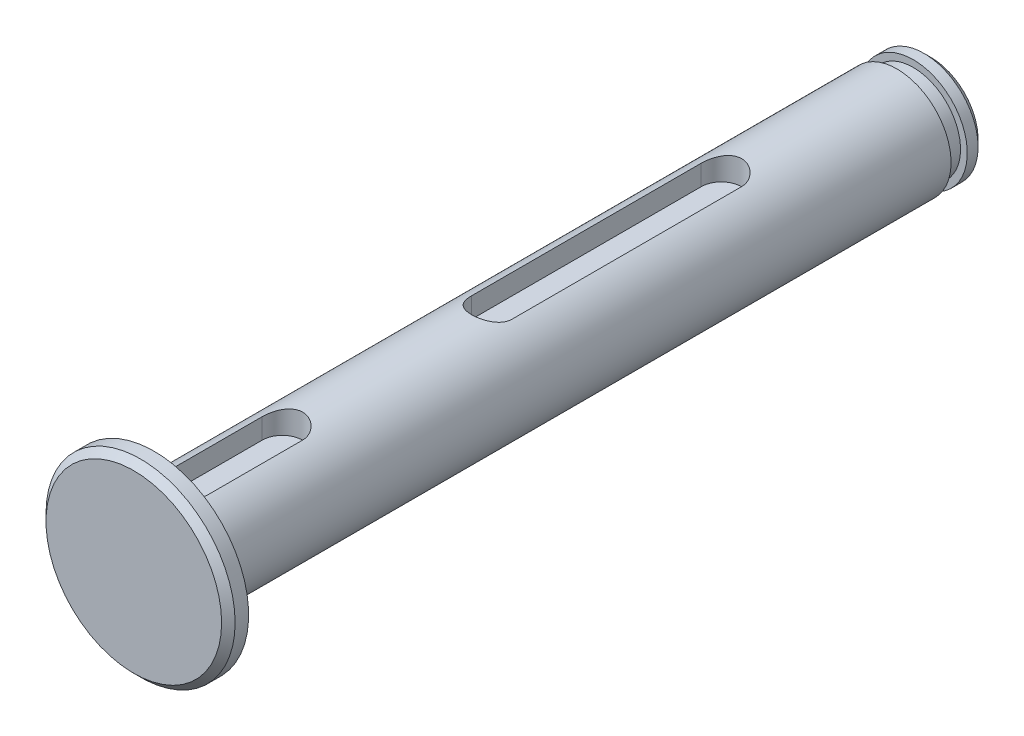
ISO-10303-21;
HEADER;
FILE_DESCRIPTION(('STEP AP214'),'2;1');
FILE_NAME('part.step','',(''),(''),'','','');
FILE_SCHEMA(('AUTOMOTIVE_DESIGN { 1 0 10303 214 1 1 1 1 }'));
ENDSEC;
DATA;
#1=APPLICATION_CONTEXT('core data for automotive mechanical design processes');
#2=APPLICATION_PROTOCOL_DEFINITION('international standard','automotive_design',2000,#1);
#3=PRODUCT_CONTEXT('',#1,'mechanical');
#4=PRODUCT('Part','Part','',(#3));
#5=PRODUCT_RELATED_PRODUCT_CATEGORY('part','',(#4));
#6=PRODUCT_DEFINITION_FORMATION('','',#4);
#7=PRODUCT_DEFINITION_CONTEXT('part definition',#1,'design');
#8=PRODUCT_DEFINITION('design','',#6,#7);
#9=PRODUCT_DEFINITION_SHAPE('','',#8);
#10=(LENGTH_UNIT() NAMED_UNIT(*) SI_UNIT(.MILLI.,.METRE.));
#11=(NAMED_UNIT(*) PLANE_ANGLE_UNIT() SI_UNIT($,.RADIAN.));
#12=(NAMED_UNIT(*) SI_UNIT($,.STERADIAN.) SOLID_ANGLE_UNIT());
#13=UNCERTAINTY_MEASURE_WITH_UNIT(LENGTH_MEASURE(1.E-05),#10,'distance_accuracy_value','');
#14=(GEOMETRIC_REPRESENTATION_CONTEXT(3) GLOBAL_UNCERTAINTY_ASSIGNED_CONTEXT((#13)) GLOBAL_UNIT_ASSIGNED_CONTEXT((#10,
#11,#12)) REPRESENTATION_CONTEXT('',''));
#15=CARTESIAN_POINT('',(0.,0.,0.));
#16=DIRECTION('',(0.,0.,1.));
#17=DIRECTION('',(1.,0.,0.));
#18=AXIS2_PLACEMENT_3D('',#15,#16,#17);
#19=CARTESIAN_POINT('',(0.,0.,-49.376724137931));
#20=DIRECTION('',(0.,0.,-1.));
#21=DIRECTION('',(-1.,0.,0.));
#22=AXIS2_PLACEMENT_3D('',#19,#20,#21);
#23=CYLINDRICAL_SURFACE('',#22,3.99999999999999);
#24=DIRECTION('',(0.,0.,-1.));
#25=VECTOR('',#24,1.);
#26=CARTESIAN_POINT('',(1.49999999999999,3.70809924354782,-49.376724137931));
#27=LINE('',#26,#25);
#28=CARTESIAN_POINT('',(1.5,3.70809924354782,14.2));
#29=VERTEX_POINT('',#28);
#30=CARTESIAN_POINT('',(1.50000000000001,3.70809924354782,31.2));
#31=VERTEX_POINT('',#30);
#32=EDGE_CURVE('E189',#29,#31,#27,.F.);
#33=ORIENTED_EDGE('',*,*,#32,.T.);
#34=CARTESIAN_POINT('',(0.,3.99999999999999,29.7));
#35=CARTESIAN_POINT('',(0.0812350589378579,4.0000021745615,29.6999970976969));
#36=CARTESIAN_POINT('',(0.162450241781797,3.99750379283183,29.7066197602484));
#37=CARTESIAN_POINT('',(0.322453452352366,3.98778696006926,29.7328281952699));
#38=CARTESIAN_POINT('',(0.401241827987621,3.98056918893992,29.7524121004706));
#39=CARTESIAN_POINT('',(0.554060784990884,3.96218832391543,29.8037530017718));
#40=CARTESIAN_POINT('',(0.628100224162283,3.95103284349438,29.8354865168218));
#41=CARTESIAN_POINT('',(0.769799310160259,3.92588767765352,29.9101064130158));
#42=CARTESIAN_POINT('',(0.837457239177885,3.91189723227546,29.9529957855442));
#43=CARTESIAN_POINT('',(0.967346417045831,3.88186246971215,30.0506125310709));
#44=CARTESIAN_POINT('',(1.0292707301512,3.86576002583564,30.1057302622594));
#45=CARTESIAN_POINT('',(1.14324421474364,3.83360220871325,30.2254104346588));
#46=CARTESIAN_POINT('',(1.19529036359203,3.81754685135031,30.2899757560879));
#47=CARTESIAN_POINT('',(1.28998202215986,3.7866247061773,30.4297174675232));
#48=CARTESIAN_POINT('',(1.3321939319576,3.77182648820817,30.5052043665458));
#49=CARTESIAN_POINT('',(1.40318646334085,3.74599860237432,30.6628483541685));
#50=CARTESIAN_POINT('',(1.4319724496124,3.73496742975879,30.7450027631551));
#51=CARTESIAN_POINT('',(1.4740843101755,3.71854412824134,30.9101167402582));
#52=CARTESIAN_POINT('',(1.48799593218558,3.71293924350836,30.9929050384354));
#53=CARTESIAN_POINT('',(1.50179556531648,3.70738061461213,31.1598161579938));
#54=CARTESIAN_POINT('',(1.50168936802631,3.70742453659303,31.2439384138745));
#55=CARTESIAN_POINT('',(1.48790429610019,3.71297511632053,31.405769525213));
#56=CARTESIAN_POINT('',(1.47503808509004,3.7181546887112,31.4835609060442));
#57=CARTESIAN_POINT('',(1.43744167868331,3.73284938059528,31.6357871504053));
#58=CARTESIAN_POINT('',(1.41270969663259,3.74236515298861,31.7102215066139));
#59=CARTESIAN_POINT('',(1.35163748571905,3.76485702190251,31.8552770677282));
#60=CARTESIAN_POINT('',(1.31508648737101,3.77789517988164,31.9257994861213));
#61=CARTESIAN_POINT('',(1.23156073762698,3.80594210139318,32.059945737591));
#62=CARTESIAN_POINT('',(1.18458238728897,3.82095154457156,32.1235671775197));
#63=CARTESIAN_POINT('',(1.07781780766549,3.85248038859111,32.2466036636509));
#64=CARTESIAN_POINT('',(1.01738298716956,3.86903347455669,32.3054486407481));
#65=CARTESIAN_POINT('',(0.887312590819027,3.90091728164084,32.4123379662058));
#66=CARTESIAN_POINT('',(0.817675603497372,3.9162478146595,32.4603806546057));
#67=CARTESIAN_POINT('',(0.669723436992429,3.94426394809078,32.5449303970625));
#68=CARTESIAN_POINT('',(0.591290713844728,3.95690498259614,32.5812475812211));
#69=CARTESIAN_POINT('',(0.428836850524591,3.97778718326961,32.63998260427));
#70=CARTESIAN_POINT('',(0.344818210845774,3.98603030341492,32.6624066165611));
#71=CARTESIAN_POINT('',(0.178375243148671,3.99684443228064,32.6916227875419));
#72=CARTESIAN_POINT('',(0.0961036195622152,3.99969369025685,32.6991826063825));
#73=CARTESIAN_POINT('',(-0.0685724752550181,4.00025893700124,32.7006910638999));
#74=CARTESIAN_POINT('',(-0.150976912983366,3.99797606386862,32.6946427203168));
#75=CARTESIAN_POINT('',(-0.310262048561852,3.98871709772642,32.6696899576913));
#76=CARTESIAN_POINT('',(-0.387233328007329,3.98192470962304,32.6512884562629));
#77=CARTESIAN_POINT('',(-0.536941754957214,3.96451477091716,32.6028139274527));
#78=CARTESIAN_POINT('',(-0.609678350347527,3.95389672282029,32.572739382052));
#79=CARTESIAN_POINT('',(-0.751247765110149,3.9294962440768,32.5008135875605));
#80=CARTESIAN_POINT('',(-0.819903083557789,3.91563000209347,32.4586422707766));
#81=CARTESIAN_POINT('',(-0.949392711726619,3.88626671564663,32.3640818968284));
#82=CARTESIAN_POINT('',(-1.01022412027044,3.87076907009515,32.3116890674548));
#83=CARTESIAN_POINT('',(-1.12603079874454,3.83873329490988,32.1945958778757));
#84=CARTESIAN_POINT('',(-1.18046154123568,3.82218696503728,32.1293578172273));
#85=CARTESIAN_POINT('',(-1.27771050031903,3.79078815746852,31.9903486152923));
#86=CARTESIAN_POINT('',(-1.32052767414518,3.77593583194398,31.9165767086115));
#87=CARTESIAN_POINT('',(-1.39337773518997,3.74966829822462,31.7619840132277));
#88=CARTESIAN_POINT('',(-1.42335685446917,3.73826760328492,31.6811352540896));
#89=CARTESIAN_POINT('',(-1.46907883466888,3.72054032891004,31.5149902363122));
#90=CARTESIAN_POINT('',(-1.48483050305534,3.71421061057489,31.4296967638019));
#91=CARTESIAN_POINT('',(-1.50086347097839,3.70775894792572,31.2629838404589));
#92=CARTESIAN_POINT('',(-1.50207331495837,3.7072644452334,31.1816673682831));
#93=CARTESIAN_POINT('',(-1.49136715641592,3.71158412745291,31.0200546837238));
#94=CARTESIAN_POINT('',(-1.47945239850123,3.71639780898898,30.9397583753284));
#95=CARTESIAN_POINT('',(-1.44355815630241,3.73048141585431,30.7849527732835));
#96=CARTESIAN_POINT('',(-1.41995798316524,3.73961085376662,30.7103416537547));
#97=CARTESIAN_POINT('',(-1.36169696779919,3.76121548297843,30.5660944915056));
#98=CARTESIAN_POINT('',(-1.32703332944944,3.77369151995213,30.4964597119299));
#99=CARTESIAN_POINT('',(-1.24552075938153,3.80139723903963,30.3601732103024));
#100=CARTESIAN_POINT('',(-1.1981283280301,3.81673698440963,30.2938692032001));
#101=CARTESIAN_POINT('',(-1.09334485729906,3.84806246757176,30.1698584390288));
#102=CARTESIAN_POINT('',(-1.03595064012808,3.86404840943144,30.1121544252132));
#103=CARTESIAN_POINT('',(-0.909080396784617,3.8959042460988,30.0037980441782));
#104=CARTESIAN_POINT('',(-0.839118644212986,3.91172104900643,29.9536962465653));
#105=CARTESIAN_POINT('',(-0.691213223200815,3.94054514457029,29.8659773447234));
#106=CARTESIAN_POINT('',(-0.613268934090616,3.95355221851558,29.8283612122636));
#107=CARTESIAN_POINT('',(-0.447999082002307,3.97574292606679,29.7656231709517));
#108=CARTESIAN_POINT('',(-0.360413422234203,3.98473657158355,29.7411129353981));
#109=CARTESIAN_POINT('',(-0.181875733606377,3.99686242179585,29.7083070400793));
#110=CARTESIAN_POINT('',(-0.0909254163648536,3.99999756603966,29.7000032485127));
#111=CARTESIAN_POINT('',(0.,3.99999999999999,29.7));
#112=B_SPLINE_CURVE_WITH_KNOTS('',3,(#34,#35,#36,#37,#38,#39,#40,#41,#42,#43,#44,#45,#46,#47,
#48,#49,#50,#51,#52,#53,#54,#55,#56,#57,#58,#59,#60,#61,#62,#63,#64,#65,#66,#67,#68,#69,#70,#71,
#72,#73,#74,#75,#76,#77,#78,#79,#80,#81,#82,#83,#84,#85,#86,#87,#88,#89,#90,#91,#92,#93,#94,#95,
#96,#97,#98,#99,#100,#101,#102,#103,#104,#105,#106,#107,#108,#109,#110,#111),.UNSPECIFIED.,.T.,
.F.,(4,2,2,2,2,2,2,2,2,2,2,2,2,2,2,2,2,2,2,2,2,2,2,2,2,2,2,2,2,2,2,2,2,2,2,2,2,2,4),(0.,
0.24336980156056,0.48670454953046,0.729571369213574,0.972503379609491,1.22473618582716,
1.47704604925622,1.73896674501659,2.00078269352134,2.25185874416902,2.50283106079708,
2.73878345119971,2.97477138060588,3.21522408387018,3.45575990744258,3.71246153335813,
3.96920257905065,4.22991375286075,4.49050899698846,4.73725019635925,4.9839366839052,
5.2211443792384,5.45838293254453,5.70259221859599,5.94689180019867,6.20536519455657,
6.46386178920141,6.72343066727203,6.98283874956506,7.22558763480252,7.46831350211259,
7.70363142426533,7.93900886656506,8.18672471884271,8.43451941997062,8.69572329654039,
8.95694749805102,9.22948515032042,9.50188601796127),.UNSPECIFIED.);
#113=CARTESIAN_POINT('',(-1.5,3.70809924354782,31.2));
#114=VERTEX_POINT('',#113);
#115=EDGE_CURVE('E212',#31,#114,#112,.T.);
#116=ORIENTED_EDGE('',*,*,#115,.T.);
#117=DIRECTION('',(0.,0.,-1.));
#118=VECTOR('',#117,1.);
#119=CARTESIAN_POINT('',(-1.50000000000001,3.70809924354781,-49.376724137931));
#120=LINE('',#119,#118);
#121=CARTESIAN_POINT('',(-1.50000000000001,3.70809924354781,14.2));
#122=VERTEX_POINT('',#121);
#123=EDGE_CURVE('E180',#114,#122,#120,.T.);
#124=ORIENTED_EDGE('',*,*,#123,.T.);
#125=CARTESIAN_POINT('',(0.,3.99999999999999,12.7));
#126=CARTESIAN_POINT('',(0.0812350589378556,4.0000021745615,12.6999970976969));
#127=CARTESIAN_POINT('',(0.162450241781795,3.99750379283183,12.7066197602484));
#128=CARTESIAN_POINT('',(0.322453452352363,3.98778696006926,12.7328281952699));
#129=CARTESIAN_POINT('',(0.401241827987618,3.98056918893992,12.7524121004706));
#130=CARTESIAN_POINT('',(0.554060784990881,3.96218832391543,12.8037530017718));
#131=CARTESIAN_POINT('',(0.628100224162279,3.95103284349439,12.8354865168218));
#132=CARTESIAN_POINT('',(0.769799310160255,3.92588767765352,12.9101064130158));
#133=CARTESIAN_POINT('',(0.837457239177881,3.91189723227546,12.9529957855442));
#134=CARTESIAN_POINT('',(0.967346417045827,3.88186246971215,13.0506125310709));
#135=CARTESIAN_POINT('',(1.02927073015119,3.86576002583564,13.1057302622594));
#136=CARTESIAN_POINT('',(1.14324421474363,3.83360220871325,13.2254104346588));
#137=CARTESIAN_POINT('',(1.19529036359203,3.81754685135031,13.2899757560879));
#138=CARTESIAN_POINT('',(1.28998202215985,3.7866247061773,13.4297174675232));
#139=CARTESIAN_POINT('',(1.3321939319576,3.77182648820817,13.5052043665458));
#140=CARTESIAN_POINT('',(1.40318646334085,3.74599860237432,13.6628483541685));
#141=CARTESIAN_POINT('',(1.43197244961239,3.73496742975879,13.7450027631551));
#142=CARTESIAN_POINT('',(1.47408431017549,3.71854412824134,13.9101167402582));
#143=CARTESIAN_POINT('',(1.48799593218558,3.71293924350836,13.9929050384354));
#144=CARTESIAN_POINT('',(1.50179556531648,3.70738061461213,14.1598161579938));
#145=CARTESIAN_POINT('',(1.50168936802631,3.70742453659303,14.2439384138745));
#146=CARTESIAN_POINT('',(1.48790429610018,3.71297511632053,14.405769525213));
#147=CARTESIAN_POINT('',(1.47503808509004,3.7181546887112,14.4835609060442));
#148=CARTESIAN_POINT('',(1.4374416786833,3.73284938059528,14.6357871504053));
#149=CARTESIAN_POINT('',(1.41270969663259,3.74236515298861,14.7102215066139));
#150=CARTESIAN_POINT('',(1.35163748571904,3.76485702190251,14.8552770677282));
#151=CARTESIAN_POINT('',(1.31508648737101,3.77789517988164,14.9257994861213));
#152=CARTESIAN_POINT('',(1.23156073762698,3.80594210139318,15.059945737591));
#153=CARTESIAN_POINT('',(1.18458238728897,3.82095154457156,15.1235671775197));
#154=CARTESIAN_POINT('',(1.07781780766549,3.85248038859111,15.2466036636509));
#155=CARTESIAN_POINT('',(1.01738298716956,3.86903347455669,15.3054486407481));
#156=CARTESIAN_POINT('',(0.887312590819025,3.90091728164084,15.4123379662058));
#157=CARTESIAN_POINT('',(0.817675603497368,3.9162478146595,15.4603806546057));
#158=CARTESIAN_POINT('',(0.669723436992423,3.94426394809078,15.5449303970625));
#159=CARTESIAN_POINT('',(0.591290713844723,3.95690498259615,15.5812475812211));
#160=CARTESIAN_POINT('',(0.428836850524587,3.97778718326961,15.63998260427));
#161=CARTESIAN_POINT('',(0.344818210845772,3.98603030341492,15.6624066165611));
#162=CARTESIAN_POINT('',(0.17837524314867,3.99684443228064,15.6916227875419));
#163=CARTESIAN_POINT('',(0.0961036195622138,3.99969369025685,15.6991826063825));
#164=CARTESIAN_POINT('',(-0.0685724752550199,4.00025893700124,15.7006910638999));
#165=CARTESIAN_POINT('',(-0.150976912983369,3.99797606386862,15.6946427203168));
#166=CARTESIAN_POINT('',(-0.310262048561855,3.98871709772642,15.6696899576913));
#167=CARTESIAN_POINT('',(-0.387233328007333,3.98192470962303,15.6512884562629));
#168=CARTESIAN_POINT('',(-0.536941754957218,3.96451477091716,15.6028139274527));
#169=CARTESIAN_POINT('',(-0.609678350347531,3.95389672282029,15.572739382052));
#170=CARTESIAN_POINT('',(-0.751247765110151,3.9294962440768,15.5008135875605));
#171=CARTESIAN_POINT('',(-0.819903083557791,3.91563000209347,15.4586422707766));
#172=CARTESIAN_POINT('',(-0.949392711726621,3.88626671564663,15.3640818968284));
#173=CARTESIAN_POINT('',(-1.01022412027045,3.87076907009515,15.3116890674548));
#174=CARTESIAN_POINT('',(-1.12603079874454,3.83873329490988,15.1945958778757));
#175=CARTESIAN_POINT('',(-1.18046154123568,3.82218696503728,15.1293578172273));
#176=CARTESIAN_POINT('',(-1.27771050031903,3.79078815746852,14.9903486152923));
#177=CARTESIAN_POINT('',(-1.32052767414518,3.77593583194398,14.9165767086115));
#178=CARTESIAN_POINT('',(-1.39337773518997,3.74966829822462,14.7619840132277));
#179=CARTESIAN_POINT('',(-1.42335685446918,3.73826760328492,14.6811352540896));
#180=CARTESIAN_POINT('',(-1.46907883466889,3.72054032891004,14.5149902363122));
#181=CARTESIAN_POINT('',(-1.48483050305535,3.71421061057489,14.4296967638019));
#182=CARTESIAN_POINT('',(-1.50086347097839,3.70775894792572,14.2629838404589));
#183=CARTESIAN_POINT('',(-1.50207331495837,3.7072644452334,14.1816673682831));
#184=CARTESIAN_POINT('',(-1.49136715641592,3.71158412745291,14.0200546837238));
#185=CARTESIAN_POINT('',(-1.47945239850123,3.71639780898897,13.9397583753284));
#186=CARTESIAN_POINT('',(-1.44355815630241,3.73048141585431,13.7849527732834));
#187=CARTESIAN_POINT('',(-1.41995798316524,3.73961085376661,13.7103416537547));
#188=CARTESIAN_POINT('',(-1.36169696779919,3.76121548297843,13.5660944915056));
#189=CARTESIAN_POINT('',(-1.32703332944944,3.77369151995213,13.4964597119299));
#190=CARTESIAN_POINT('',(-1.24552075938154,3.80139723903963,13.3601732103024));
#191=CARTESIAN_POINT('',(-1.1981283280301,3.81673698440963,13.2938692032001));
#192=CARTESIAN_POINT('',(-1.09334485729906,3.84806246757176,13.1698584390288));
#193=CARTESIAN_POINT('',(-1.03595064012808,3.86404840943144,13.1121544252132));
#194=CARTESIAN_POINT('',(-0.909080396784622,3.8959042460988,13.0037980441782));
#195=CARTESIAN_POINT('',(-0.839118644212992,3.91172104900643,12.9536962465653));
#196=CARTESIAN_POINT('',(-0.691213223200821,3.94054514457029,12.8659773447234));
#197=CARTESIAN_POINT('',(-0.613268934090621,3.95355221851558,12.8283612122636));
#198=CARTESIAN_POINT('',(-0.447999082002311,3.97574292606679,12.7656231709517));
#199=CARTESIAN_POINT('',(-0.360413422234206,3.98473657158355,12.7411129353981));
#200=CARTESIAN_POINT('',(-0.181875733606379,3.99686242179585,12.7083070400793));
#201=CARTESIAN_POINT('',(-0.0909254163648563,3.99999756603966,12.7000032485127));
#202=CARTESIAN_POINT('',(0.,3.99999999999999,12.7));
#203=B_SPLINE_CURVE_WITH_KNOTS('',3,(#125,#126,#127,#128,#129,#130,#131,#132,#133,#134,#135,
#136,#137,#138,#139,#140,#141,#142,#143,#144,#145,#146,#147,#148,#149,#150,#151,#152,#153,#154,
#155,#156,#157,#158,#159,#160,#161,#162,#163,#164,#165,#166,#167,#168,#169,#170,#171,#172,#173,
#174,#175,#176,#177,#178,#179,#180,#181,#182,#183,#184,#185,#186,#187,#188,#189,#190,#191,#192,
#193,#194,#195,#196,#197,#198,#199,#200,#201,#202),.UNSPECIFIED.,.T.,.F.,(4,2,2,2,2,2,2,2,2,2,2,
2,2,2,2,2,2,2,2,2,2,2,2,2,2,2,2,2,2,2,2,2,2,2,2,2,2,2,4),(0.,0.243369801560559,0.48670454953046,
0.729571369213572,0.972503379609489,1.22473618582715,1.47704604925622,1.73896674501659,
2.00078269352134,2.25185874416901,2.50283106079707,2.73878345119971,2.97477138060589,
3.21522408387018,3.45575990744258,3.71246153335813,3.96920257905066,4.22991375286075,
4.49050899698845,4.73725019635925,4.9839366839052,5.2211443792384,5.45838293254453,
5.70259221859599,5.94689180019867,6.20536519455657,6.4638617892014,6.72343066727203,
6.98283874956506,7.22558763480252,7.46831350211258,7.70363142426533,7.93900886656506,
8.1867247188427,8.43451941997061,8.69572329654039,8.95694749805102,9.22948515032042,
9.50188601796127),.UNSPECIFIED.);
#204=EDGE_CURVE('E183',#122,#29,#203,.T.);
#205=ORIENTED_EDGE('',*,*,#204,.T.);
#206=EDGE_LOOP('',(#33,#116,#124,#205));
#207=FACE_BOUND('',#206,.T.);
#208=CARTESIAN_POINT('',(0.,0.,56.2));
#209=DIRECTION('',(0.,0.,-1.));
#210=DIRECTION('',(-1.,0.,0.));
#211=AXIS2_PLACEMENT_3D('',#208,#209,#210);
#212=CIRCLE('',#211,3.99999999999999);
#213=CARTESIAN_POINT('',(-3.99999999999999,0.,56.2));
#214=VERTEX_POINT('',#213);
#215=EDGE_CURVE('E153',#214,#214,#212,.T.);
#216=ORIENTED_EDGE('',*,*,#215,.T.);
#217=EDGE_LOOP('',(#216));
#218=FACE_BOUND('',#217,.T.);
#219=CARTESIAN_POINT('',(0.,0.,1.2));
#220=DIRECTION('',(0.,0.,-1.));
#221=DIRECTION('',(-1.,0.,0.));
#222=AXIS2_PLACEMENT_3D('',#219,#220,#221);
#223=CIRCLE('',#222,3.99999999999999);
#224=CARTESIAN_POINT('',(-3.99999999999999,0.,1.2));
#225=VERTEX_POINT('',#224);
#226=EDGE_CURVE('E156',#225,#225,#223,.T.);
#227=ORIENTED_EDGE('',*,*,#226,.F.);
#228=EDGE_LOOP('',(#227));
#229=FACE_BOUND('',#228,.T.);
#230=DIRECTION('',(0.,0.,-1.));
#231=VECTOR('',#230,1.);
#232=CARTESIAN_POINT('',(-1.50000000000001,3.70809924354781,-49.376724137931));
#233=LINE('',#232,#231);
#234=CARTESIAN_POINT('',(-1.49999999999999,3.70809924354782,53.7));
#235=VERTEX_POINT('',#234);
#236=CARTESIAN_POINT('',(-1.49999999999999,3.70809924354782,46.7));
#237=VERTEX_POINT('',#236);
#238=EDGE_CURVE('E43',#235,#237,#233,.T.);
#239=ORIENTED_EDGE('',*,*,#238,.T.);
#240=CARTESIAN_POINT('',(0.,3.99999999999999,45.2));
#241=CARTESIAN_POINT('',(0.0812350589378599,4.0000021745615,45.1999970976969));
#242=CARTESIAN_POINT('',(0.162450241781799,3.99750379283183,45.2066197602484));
#243=CARTESIAN_POINT('',(0.322453452352368,3.98778696006926,45.2328281952699));
#244=CARTESIAN_POINT('',(0.401241827987623,3.98056918893992,45.2524121004706));
#245=CARTESIAN_POINT('',(0.554060784990886,3.96218832391543,45.3037530017718));
#246=CARTESIAN_POINT('',(0.628100224162285,3.95103284349438,45.3354865168218));
#247=CARTESIAN_POINT('',(0.769799310160262,3.92588767765351,45.4101064130158));
#248=CARTESIAN_POINT('',(0.837457239177888,3.91189723227546,45.4529957855442));
#249=CARTESIAN_POINT('',(0.967346417045836,3.88186246971215,45.5506125310709));
#250=CARTESIAN_POINT('',(1.0292707301512,3.86576002583564,45.6057302622594));
#251=CARTESIAN_POINT('',(1.14324421474364,3.83360220871325,45.7254104346589));
#252=CARTESIAN_POINT('',(1.19529036359204,3.81754685135031,45.7899757560879));
#253=CARTESIAN_POINT('',(1.28998202215986,3.7866247061773,45.9297174675232));
#254=CARTESIAN_POINT('',(1.3321939319576,3.77182648820817,46.0052043665458));
#255=CARTESIAN_POINT('',(1.40318646334085,3.74599860237432,46.1628483541685));
#256=CARTESIAN_POINT('',(1.4319724496124,3.73496742975879,46.2450027631551));
#257=CARTESIAN_POINT('',(1.4740843101755,3.71854412824134,46.4101167402582));
#258=CARTESIAN_POINT('',(1.48799593218558,3.71293924350836,46.4929050384354));
#259=CARTESIAN_POINT('',(1.50179556531649,3.70738061461213,46.6598161579938));
#260=CARTESIAN_POINT('',(1.50168936802631,3.70742453659303,46.7439384138745));
#261=CARTESIAN_POINT('',(1.48790429610019,3.71297511632053,46.905769525213));
#262=CARTESIAN_POINT('',(1.47503808509004,3.7181546887112,46.9835609060442));
#263=CARTESIAN_POINT('',(1.43744167868331,3.73284938059528,47.1357871504053));
#264=CARTESIAN_POINT('',(1.41270969663259,3.74236515298861,47.2102215066139));
#265=CARTESIAN_POINT('',(1.35163748571905,3.76485702190251,47.3552770677282));
#266=CARTESIAN_POINT('',(1.31508648737101,3.77789517988164,47.4257994861213));
#267=CARTESIAN_POINT('',(1.23156073762699,3.80594210139318,47.559945737591));
#268=CARTESIAN_POINT('',(1.18458238728897,3.82095154457156,47.6235671775197));
#269=CARTESIAN_POINT('',(1.07781780766549,3.85248038859111,47.7466036636509));
#270=CARTESIAN_POINT('',(1.01738298716956,3.86903347455669,47.8054486407481));
#271=CARTESIAN_POINT('',(0.887312590819023,3.90091728164084,47.9123379662058));
#272=CARTESIAN_POINT('',(0.817675603497366,3.9162478146595,47.9603806546057));
#273=CARTESIAN_POINT('',(0.669723436992421,3.94426394809078,48.0449303970625));
#274=CARTESIAN_POINT('',(0.59129071384472,3.95690498259615,48.0812475812211));
#275=CARTESIAN_POINT('',(0.428836850524585,3.97778718326961,48.13998260427));
#276=CARTESIAN_POINT('',(0.344818210845771,3.98603030341492,48.1624066165611));
#277=CARTESIAN_POINT('',(0.17837524314867,3.99684443228064,48.1916227875419));
#278=CARTESIAN_POINT('',(0.0961036195622148,3.99969369025685,48.1991826063825));
#279=CARTESIAN_POINT('',(-0.0685724752550182,4.00025893700124,48.2006910638999));
#280=CARTESIAN_POINT('',(-0.150976912983367,3.99797606386862,48.1946427203168));
#281=CARTESIAN_POINT('',(-0.310262048561852,3.98871709772642,48.1696899576913));
#282=CARTESIAN_POINT('',(-0.387233328007329,3.98192470962304,48.1512884562629));
#283=CARTESIAN_POINT('',(-0.536941754957214,3.96451477091716,48.1028139274527));
#284=CARTESIAN_POINT('',(-0.609678350347527,3.95389672282029,48.072739382052));
#285=CARTESIAN_POINT('',(-0.751247765110148,3.9294962440768,48.0008135875605));
#286=CARTESIAN_POINT('',(-0.819903083557788,3.91563000209347,47.9586422707766));
#287=CARTESIAN_POINT('',(-0.949392711726618,3.88626671564663,47.8640818968284));
#288=CARTESIAN_POINT('',(-1.01022412027044,3.87076907009515,47.8116890674548));
#289=CARTESIAN_POINT('',(-1.12603079874453,3.83873329490988,47.6945958778757));
#290=CARTESIAN_POINT('',(-1.18046154123568,3.82218696503728,47.6293578172273));
#291=CARTESIAN_POINT('',(-1.27771050031902,3.79078815746852,47.4903486152923));
#292=CARTESIAN_POINT('',(-1.32052767414518,3.77593583194398,47.4165767086115));
#293=CARTESIAN_POINT('',(-1.39337773518997,3.74966829822462,47.2619840132277));
#294=CARTESIAN_POINT('',(-1.42335685446917,3.73826760328492,47.1811352540896));
#295=CARTESIAN_POINT('',(-1.46907883466888,3.72054032891004,47.0149902363122));
#296=CARTESIAN_POINT('',(-1.48483050305534,3.71421061057489,46.9296967638019));
#297=CARTESIAN_POINT('',(-1.50086347097838,3.70775894792572,46.7629838404589));
#298=CARTESIAN_POINT('',(-1.50207331495837,3.7072644452334,46.6816673682831));
#299=CARTESIAN_POINT('',(-1.49136715641592,3.71158412745291,46.5200546837238));
#300=CARTESIAN_POINT('',(-1.47945239850123,3.71639780898898,46.4397583753284));
#301=CARTESIAN_POINT('',(-1.44355815630241,3.73048141585431,46.2849527732835));
#302=CARTESIAN_POINT('',(-1.41995798316523,3.73961085376662,46.2103416537547));
#303=CARTESIAN_POINT('',(-1.36169696779919,3.76121548297844,46.0660944915056));
#304=CARTESIAN_POINT('',(-1.32703332944944,3.77369151995213,45.9964597119299));
#305=CARTESIAN_POINT('',(-1.24552075938153,3.80139723903963,45.8601732103024));
#306=CARTESIAN_POINT('',(-1.19812832803009,3.81673698440963,45.7938692032001));
#307=CARTESIAN_POINT('',(-1.09334485729905,3.84806246757176,45.6698584390288));
#308=CARTESIAN_POINT('',(-1.03595064012807,3.86404840943144,45.6121544252132));
#309=CARTESIAN_POINT('',(-0.909080396784611,3.8959042460988,45.5037980441782));
#310=CARTESIAN_POINT('',(-0.839118644212981,3.91172104900643,45.4536962465653));
#311=CARTESIAN_POINT('',(-0.69121322320081,3.94054514457029,45.3659773447234));
#312=CARTESIAN_POINT('',(-0.613268934090611,3.95355221851558,45.3283612122636));
#313=CARTESIAN_POINT('',(-0.447999082002302,3.97574292606679,45.2656231709517));
#314=CARTESIAN_POINT('',(-0.360413422234199,3.98473657158355,45.2411129353981));
#315=CARTESIAN_POINT('',(-0.181875733606374,3.99686242179585,45.2083070400793));
#316=CARTESIAN_POINT('',(-0.0909254163648513,3.99999756603966,45.2000032485127));
#317=CARTESIAN_POINT('',(0.,3.99999999999999,45.2));
#318=B_SPLINE_CURVE_WITH_KNOTS('',3,(#240,#241,#242,#243,#244,#245,#246,#247,#248,#249,#250,
#251,#252,#253,#254,#255,#256,#257,#258,#259,#260,#261,#262,#263,#264,#265,#266,#267,#268,#269,
#270,#271,#272,#273,#274,#275,#276,#277,#278,#279,#280,#281,#282,#283,#284,#285,#286,#287,#288,
#289,#290,#291,#292,#293,#294,#295,#296,#297,#298,#299,#300,#301,#302,#303,#304,#305,#306,#307,
#308,#309,#310,#311,#312,#313,#314,#315,#316,#317),.UNSPECIFIED.,.T.,.F.,(4,2,2,2,2,2,2,2,2,2,2,
2,2,2,2,2,2,2,2,2,2,2,2,2,2,2,2,2,2,2,2,2,2,2,2,2,2,2,4),(0.,0.243369801560561,
0.486704549530461,0.729571369213574,0.972503379609492,1.22473618582716,1.47704604925622,
1.73896674501658,2.00078269352134,2.25185874416901,2.50283106079707,2.73878345119971,
2.97477138060589,3.21522408387018,3.45575990744258,3.71246153335813,3.96920257905066,
4.22991375286076,4.49050899698846,4.73725019635925,4.98393668390521,5.2211443792384,
5.45838293254453,5.70259221859599,5.94689180019867,6.20536519455657,6.46386178920141,
6.72343066727202,6.98283874956507,7.22558763480252,7.46831350211258,7.70363142426534,
7.93900886656507,8.18672471884272,8.43451941997062,8.69572329654039,8.95694749805102,
9.22948515032042,9.50188601796127),.UNSPECIFIED.);
#319=CARTESIAN_POINT('',(1.50000000000001,3.70809924354782,46.7));
#320=VERTEX_POINT('',#319);
#321=EDGE_CURVE('E11',#237,#320,#318,.T.);
#322=ORIENTED_EDGE('',*,*,#321,.T.);
#323=DIRECTION('',(0.,0.,-1.));
#324=VECTOR('',#323,1.);
#325=CARTESIAN_POINT('',(1.49999999999999,3.70809924354782,-49.376724137931));
#326=LINE('',#325,#324);
#327=CARTESIAN_POINT('',(1.49999999999999,3.70809924354782,53.7));
#328=VERTEX_POINT('',#327);
#329=EDGE_CURVE('E108',#320,#328,#326,.F.);
#330=ORIENTED_EDGE('',*,*,#329,.T.);
#331=CARTESIAN_POINT('',(0.,3.99999999999999,52.2));
#332=CARTESIAN_POINT('',(0.0812350589378609,4.0000021745615,52.1999970976969));
#333=CARTESIAN_POINT('',(0.1624502417818,3.99750379283183,52.2066197602484));
#334=CARTESIAN_POINT('',(0.322453452352369,3.98778696006926,52.2328281952699));
#335=CARTESIAN_POINT('',(0.401241827987624,3.98056918893992,52.2524121004706));
#336=CARTESIAN_POINT('',(0.554060784990888,3.96218832391543,52.3037530017718));
#337=CARTESIAN_POINT('',(0.628100224162286,3.95103284349438,52.3354865168218));
#338=CARTESIAN_POINT('',(0.769799310160263,3.92588767765351,52.4101064130158));
#339=CARTESIAN_POINT('',(0.837457239177889,3.91189723227546,52.4529957855442));
#340=CARTESIAN_POINT('',(0.967346417045835,3.88186246971215,52.5506125310709));
#341=CARTESIAN_POINT('',(1.0292707301512,3.86576002583564,52.6057302622594));
#342=CARTESIAN_POINT('',(1.14324421474364,3.83360220871325,52.7254104346588));
#343=CARTESIAN_POINT('',(1.19529036359203,3.81754685135031,52.7899757560879));
#344=CARTESIAN_POINT('',(1.28998202215986,3.7866247061773,52.9297174675232));
#345=CARTESIAN_POINT('',(1.33219393195761,3.77182648820817,53.0052043665458));
#346=CARTESIAN_POINT('',(1.40318646334085,3.74599860237431,53.1628483541685));
#347=CARTESIAN_POINT('',(1.4319724496124,3.73496742975879,53.2450027631551));
#348=CARTESIAN_POINT('',(1.4740843101755,3.71854412824134,53.4101167402582));
#349=CARTESIAN_POINT('',(1.48799593218559,3.71293924350836,53.4929050384354));
#350=CARTESIAN_POINT('',(1.50179556531649,3.70738061461213,53.6598161579938));
#351=CARTESIAN_POINT('',(1.50168936802631,3.70742453659303,53.7439384138745));
#352=CARTESIAN_POINT('',(1.48790429610019,3.71297511632053,53.905769525213));
#353=CARTESIAN_POINT('',(1.47503808509004,3.7181546887112,53.9835609060442));
#354=CARTESIAN_POINT('',(1.43744167868331,3.73284938059528,54.1357871504053));
#355=CARTESIAN_POINT('',(1.41270969663259,3.74236515298861,54.2102215066139));
#356=CARTESIAN_POINT('',(1.35163748571905,3.76485702190251,54.3552770677282));
#357=CARTESIAN_POINT('',(1.31508648737102,3.77789517988164,54.4257994861213));
#358=CARTESIAN_POINT('',(1.23156073762699,3.80594210139317,54.559945737591));
#359=CARTESIAN_POINT('',(1.18458238728898,3.82095154457156,54.6235671775197));
#360=CARTESIAN_POINT('',(1.07781780766549,3.85248038859111,54.7466036636509));
#361=CARTESIAN_POINT('',(1.01738298716956,3.86903347455669,54.8054486407481));
#362=CARTESIAN_POINT('',(0.887312590819025,3.90091728164084,54.9123379662058));
#363=CARTESIAN_POINT('',(0.817675603497367,3.9162478146595,54.9603806546057));
#364=CARTESIAN_POINT('',(0.669723436992422,3.94426394809078,55.0449303970625));
#365=CARTESIAN_POINT('',(0.591290713844722,3.95690498259615,55.0812475812211));
#366=CARTESIAN_POINT('',(0.428836850524588,3.97778718326961,55.13998260427));
#367=CARTESIAN_POINT('',(0.344818210845772,3.98603030341492,55.1624066165611));
#368=CARTESIAN_POINT('',(0.178375243148671,3.99684443228064,55.1916227875419));
#369=CARTESIAN_POINT('',(0.096103619562216,3.99969369025685,55.1991826063825));
#370=CARTESIAN_POINT('',(-0.0685724752550171,4.00025893700124,55.2006910638999));
#371=CARTESIAN_POINT('',(-0.150976912983366,3.99797606386862,55.1946427203168));
#372=CARTESIAN_POINT('',(-0.310262048561852,3.98871709772642,55.1696899576913));
#373=CARTESIAN_POINT('',(-0.38723332800733,3.98192470962304,55.1512884562629));
#374=CARTESIAN_POINT('',(-0.536941754957214,3.96451477091716,55.1028139274527));
#375=CARTESIAN_POINT('',(-0.609678350347527,3.95389672282029,55.072739382052));
#376=CARTESIAN_POINT('',(-0.751247765110147,3.9294962440768,55.0008135875605));
#377=CARTESIAN_POINT('',(-0.819903083557787,3.91563000209347,54.9586422707766));
#378=CARTESIAN_POINT('',(-0.949392711726617,3.88626671564663,54.8640818968284));
#379=CARTESIAN_POINT('',(-1.01022412027044,3.87076907009515,54.8116890674548));
#380=CARTESIAN_POINT('',(-1.12603079874453,3.83873329490988,54.6945958778757));
#381=CARTESIAN_POINT('',(-1.18046154123568,3.82218696503728,54.6293578172273));
#382=CARTESIAN_POINT('',(-1.27771050031902,3.79078815746852,54.4903486152923));
#383=CARTESIAN_POINT('',(-1.32052767414518,3.77593583194398,54.4165767086115));
#384=CARTESIAN_POINT('',(-1.39337773518997,3.74966829822462,54.2619840132277));
#385=CARTESIAN_POINT('',(-1.42335685446917,3.73826760328492,54.1811352540896));
#386=CARTESIAN_POINT('',(-1.46907883466888,3.72054032891004,54.0149902363122));
#387=CARTESIAN_POINT('',(-1.48483050305534,3.71421061057489,53.9296967638019));
#388=CARTESIAN_POINT('',(-1.50086347097838,3.70775894792572,53.7629838404589));
#389=CARTESIAN_POINT('',(-1.50207331495837,3.7072644452334,53.6816673682831));
#390=CARTESIAN_POINT('',(-1.49136715641592,3.71158412745291,53.5200546837238));
#391=CARTESIAN_POINT('',(-1.47945239850123,3.71639780898898,53.4397583753284));
#392=CARTESIAN_POINT('',(-1.44355815630241,3.73048141585431,53.2849527732835));
#393=CARTESIAN_POINT('',(-1.41995798316523,3.73961085376662,53.2103416537547));
#394=CARTESIAN_POINT('',(-1.36169696779919,3.76121548297843,53.0660944915056));
#395=CARTESIAN_POINT('',(-1.32703332944944,3.77369151995213,52.9964597119299));
#396=CARTESIAN_POINT('',(-1.24552075938153,3.80139723903963,52.8601732103024));
#397=CARTESIAN_POINT('',(-1.19812832803009,3.81673698440963,52.7938692032001));
#398=CARTESIAN_POINT('',(-1.09334485729905,3.84806246757176,52.6698584390288));
#399=CARTESIAN_POINT('',(-1.03595064012807,3.86404840943144,52.6121544252132));
#400=CARTESIAN_POINT('',(-0.909080396784611,3.8959042460988,52.5037980441782));
#401=CARTESIAN_POINT('',(-0.839118644212981,3.91172104900643,52.4536962465653));
#402=CARTESIAN_POINT('',(-0.69121322320081,3.94054514457029,52.3659773447234));
#403=CARTESIAN_POINT('',(-0.613268934090611,3.95355221851558,52.3283612122636));
#404=CARTESIAN_POINT('',(-0.447999082002302,3.97574292606679,52.2656231709517));
#405=CARTESIAN_POINT('',(-0.360413422234198,3.98473657158355,52.2411129353981));
#406=CARTESIAN_POINT('',(-0.181875733606372,3.99686242179585,52.2083070400793));
#407=CARTESIAN_POINT('',(-0.0909254163648503,3.99999756603966,52.2000032485127));
#408=CARTESIAN_POINT('',(0.,3.99999999999999,52.2));
#409=B_SPLINE_CURVE_WITH_KNOTS('',3,(#331,#332,#333,#334,#335,#336,#337,#338,#339,#340,#341,
#342,#343,#344,#345,#346,#347,#348,#349,#350,#351,#352,#353,#354,#355,#356,#357,#358,#359,#360,
#361,#362,#363,#364,#365,#366,#367,#368,#369,#370,#371,#372,#373,#374,#375,#376,#377,#378,#379,
#380,#381,#382,#383,#384,#385,#386,#387,#388,#389,#390,#391,#392,#393,#394,#395,#396,#397,#398,
#399,#400,#401,#402,#403,#404,#405,#406,#407,#408),.UNSPECIFIED.,.T.,.F.,(4,2,2,2,2,2,2,2,2,2,2,
2,2,2,2,2,2,2,2,2,2,2,2,2,2,2,2,2,2,2,2,2,2,2,2,2,2,2,4),(0.,0.243369801560561,
0.486704549530461,0.729571369213575,0.972503379609492,1.22473618582716,1.47704604925622,
1.73896674501659,2.00078269352134,2.25185874416902,2.50283106079707,2.73878345119971,
2.97477138060588,3.21522408387017,3.45575990744258,3.71246153335813,3.96920257905066,
4.22991375286076,4.49050899698846,4.73725019635925,4.98393668390521,5.2211443792384,
5.45838293254454,5.702592218596,5.94689180019867,6.20536519455658,6.46386178920141,
6.72343066727204,6.98283874956507,7.22558763480252,7.46831350211258,7.70363142426533,
7.93900886656506,8.18672471884271,8.43451941997062,8.69572329654039,8.95694749805102,
9.22948515032042,9.50188601796128),.UNSPECIFIED.);
#410=EDGE_CURVE('E218',#328,#235,#409,.T.);
#411=ORIENTED_EDGE('',*,*,#410,.T.);
#412=EDGE_LOOP('',(#239,#322,#330,#411));
#413=FACE_BOUND('',#412,.T.);
#414=ADVANCED_FACE('F31',(#207,#218,#229,#413),#23,.T.);
#415=CARTESIAN_POINT('',(-3.99999999999999,0.,-1.3));
#416=DIRECTION('',(0.,0.,-1.));
#417=DIRECTION('',(-1.,0.,0.));
#418=AXIS2_PLACEMENT_3D('',#415,#416,#417);
#419=PLANE('',#418);
#420=CARTESIAN_POINT('',(0.,0.,-1.3));
#421=DIRECTION('',(0.,0.,-1.));
#422=DIRECTION('',(-1.,0.,0.));
#423=AXIS2_PLACEMENT_3D('',#420,#421,#422);
#424=CIRCLE('',#423,3.49999999999998);
#425=CARTESIAN_POINT('',(-3.49999999999998,0.,-1.3));
#426=VERTEX_POINT('',#425);
#427=EDGE_CURVE('E168',#426,#426,#424,.T.);
#428=ORIENTED_EDGE('',*,*,#427,.T.);
#429=EDGE_LOOP('',(#428));
#430=FACE_BOUND('',#429,.T.);
#431=ADVANCED_FACE('F238',(#430),#419,.T.);
#432=CARTESIAN_POINT('',(0.,0.,-49.376724137931));
#433=DIRECTION('',(0.,0.,-1.));
#434=DIRECTION('',(-1.,0.,0.));
#435=AXIS2_PLACEMENT_3D('',#432,#433,#434);
#436=CYLINDRICAL_SURFACE('',#435,3.99999999999999);
#437=CARTESIAN_POINT('',(0.,0.,-0.799999999999981));
#438=DIRECTION('',(0.,0.,-1.));
#439=DIRECTION('',(-1.,0.,0.));
#440=AXIS2_PLACEMENT_3D('',#437,#438,#439);
#441=CIRCLE('',#440,3.99999999999999);
#442=CARTESIAN_POINT('',(-3.99999999999999,0.,-0.799999999999981));
#443=VERTEX_POINT('',#442);
#444=EDGE_CURVE('E171',#443,#443,#441,.F.);
#445=ORIENTED_EDGE('',*,*,#444,.T.);
#446=EDGE_LOOP('',(#445));
#447=FACE_BOUND('',#446,.T.);
#448=CARTESIAN_POINT('',(0.,0.,0.));
#449=DIRECTION('',(0.,0.,-1.));
#450=DIRECTION('',(-1.,0.,0.));
#451=AXIS2_PLACEMENT_3D('',#448,#449,#450);
#452=CIRCLE('',#451,3.99999999999999);
#453=CARTESIAN_POINT('',(-3.99999999999999,0.,0.));
#454=VERTEX_POINT('',#453);
#455=EDGE_CURVE('E165',#454,#454,#452,.T.);
#456=ORIENTED_EDGE('',*,*,#455,.T.);
#457=EDGE_LOOP('',(#456));
#458=FACE_BOUND('',#457,.T.);
#459=ADVANCED_FACE('F243',(#447,#458),#436,.T.);
#460=CARTESIAN_POINT('',(-3.49999999999999,0.,0.));
#461=DIRECTION('',(0.,0.,1.));
#462=DIRECTION('',(1.,0.,0.));
#463=AXIS2_PLACEMENT_3D('',#460,#461,#462);
#464=PLANE('',#463);
#465=CARTESIAN_POINT('',(0.,0.,0.));
#466=DIRECTION('',(0.,0.,-1.));
#467=DIRECTION('',(-1.,0.,0.));
#468=AXIS2_PLACEMENT_3D('',#465,#466,#467);
#469=CIRCLE('',#468,3.49999999999999);
#470=CARTESIAN_POINT('',(-3.49999999999999,0.,0.));
#471=VERTEX_POINT('',#470);
#472=EDGE_CURVE('E162',#471,#471,#469,.T.);
#473=ORIENTED_EDGE('',*,*,#472,.T.);
#474=EDGE_LOOP('',(#473));
#475=FACE_BOUND('',#474,.T.);
#476=ORIENTED_EDGE('',*,*,#455,.F.);
#477=EDGE_LOOP('',(#476));
#478=FACE_BOUND('',#477,.T.);
#479=ADVANCED_FACE('F264',(#475,#478),#464,.T.);
#480=CARTESIAN_POINT('',(0.,0.,-49.376724137931));
#481=DIRECTION('',(0.,0.,-1.));
#482=DIRECTION('',(-1.,0.,0.));
#483=AXIS2_PLACEMENT_3D('',#480,#481,#482);
#484=CYLINDRICAL_SURFACE('',#483,3.49999999999999);
#485=CARTESIAN_POINT('',(0.,0.,1.2));
#486=DIRECTION('',(0.,0.,-1.));
#487=DIRECTION('',(-1.,0.,0.));
#488=AXIS2_PLACEMENT_3D('',#485,#486,#487);
#489=CIRCLE('',#488,3.49999999999999);
#490=CARTESIAN_POINT('',(-3.49999999999999,0.,1.2));
#491=VERTEX_POINT('',#490);
#492=EDGE_CURVE('E159',#491,#491,#489,.T.);
#493=ORIENTED_EDGE('',*,*,#492,.T.);
#494=EDGE_LOOP('',(#493));
#495=FACE_BOUND('',#494,.T.);
#496=ORIENTED_EDGE('',*,*,#472,.F.);
#497=EDGE_LOOP('',(#496));
#498=FACE_BOUND('',#497,.T.);
#499=ADVANCED_FACE('F259',(#495,#498),#484,.T.);
#500=CARTESIAN_POINT('',(-3.99999999999999,0.,1.2));
#501=DIRECTION('',(0.,0.,-1.));
#502=DIRECTION('',(-1.,0.,0.));
#503=AXIS2_PLACEMENT_3D('',#500,#501,#502);
#504=PLANE('',#503);
#505=ORIENTED_EDGE('',*,*,#226,.T.);
#506=EDGE_LOOP('',(#505));
#507=FACE_BOUND('',#506,.T.);
#508=ORIENTED_EDGE('',*,*,#492,.F.);
#509=EDGE_LOOP('',(#508));
#510=FACE_BOUND('',#509,.T.);
#511=ADVANCED_FACE('F255',(#507,#510),#504,.T.);
#512=CARTESIAN_POINT('',(-6.99999999999999,0.,56.2));
#513=DIRECTION('',(0.,0.,-1.));
#514=DIRECTION('',(-1.,0.,0.));
#515=AXIS2_PLACEMENT_3D('',#512,#513,#514);
#516=PLANE('',#515);
#517=CARTESIAN_POINT('',(0.,0.,56.2));
#518=DIRECTION('',(0.,0.,-1.));
#519=DIRECTION('',(-1.,0.,0.));
#520=AXIS2_PLACEMENT_3D('',#517,#518,#519);
#521=CIRCLE('',#520,6.99999999999999);
#522=CARTESIAN_POINT('',(-6.99999999999999,0.,56.2));
#523=VERTEX_POINT('',#522);
#524=EDGE_CURVE('E150',#523,#523,#521,.T.);
#525=ORIENTED_EDGE('',*,*,#524,.T.);
#526=EDGE_LOOP('',(#525));
#527=FACE_BOUND('',#526,.T.);
#528=ORIENTED_EDGE('',*,*,#215,.F.);
#529=EDGE_LOOP('',(#528));
#530=FACE_BOUND('',#529,.T.);
#531=ADVANCED_FACE('F258',(#527,#530),#516,.T.);
#532=CARTESIAN_POINT('',(0.,0.,-49.376724137931));
#533=DIRECTION('',(0.,0.,-1.));
#534=DIRECTION('',(-1.,0.,0.));
#535=AXIS2_PLACEMENT_3D('',#532,#533,#534);
#536=CYLINDRICAL_SURFACE('',#535,6.99999999999999);
#537=CARTESIAN_POINT('',(0.,0.,57.2));
#538=DIRECTION('',(0.,0.,1.));
#539=DIRECTION('',(1.,0.,0.));
#540=AXIS2_PLACEMENT_3D('',#537,#538,#539);
#541=CIRCLE('',#540,6.99999999999999);
#542=CARTESIAN_POINT('',(6.99999999999999,0.,57.2));
#543=VERTEX_POINT('',#542);
#544=EDGE_CURVE('E174',#543,#543,#541,.F.);
#545=ORIENTED_EDGE('',*,*,#544,.T.);
#546=EDGE_LOOP('',(#545));
#547=FACE_BOUND('',#546,.T.);
#548=ORIENTED_EDGE('',*,*,#524,.F.);
#549=EDGE_LOOP('',(#548));
#550=FACE_BOUND('',#549,.T.);
#551=ADVANCED_FACE('F286',(#547,#550),#536,.T.);
#552=CARTESIAN_POINT('',(0.,0.,57.7));
#553=DIRECTION('',(0.,0.,1.));
#554=DIRECTION('',(1.,0.,0.));
#555=AXIS2_PLACEMENT_3D('',#552,#553,#554);
#556=PLANE('',#555);
#557=CARTESIAN_POINT('',(0.,0.,57.7));
#558=DIRECTION('',(0.,0.,1.));
#559=DIRECTION('',(1.,0.,0.));
#560=AXIS2_PLACEMENT_3D('',#557,#558,#559);
#561=CIRCLE('',#560,6.49999999999999);
#562=CARTESIAN_POINT('',(6.49999999999999,0.,57.7));
#563=VERTEX_POINT('',#562);
#564=EDGE_CURVE('E177',#563,#563,#561,.T.);
#565=ORIENTED_EDGE('',*,*,#564,.T.);
#566=EDGE_LOOP('',(#565));
#567=FACE_BOUND('',#566,.T.);
#568=ADVANCED_FACE('F210',(#567),#556,.T.);
#569=CARTESIAN_POINT('',(0.,0.,-1.3));
#570=DIRECTION('',(0.,0.,1.));
#571=DIRECTION('',(1.,0.,0.));
#572=AXIS2_PLACEMENT_3D('',#569,#570,#571);
#573=CONICAL_SURFACE('',#572,3.49999999999998,0.785398163397446);
#574=ORIENTED_EDGE('',*,*,#444,.F.);
#575=EDGE_LOOP('',(#574));
#576=FACE_BOUND('',#575,.T.);
#577=ORIENTED_EDGE('',*,*,#427,.F.);
#578=EDGE_LOOP('',(#577));
#579=FACE_BOUND('',#578,.T.);
#580=ADVANCED_FACE('F278',(#576,#579),#573,.T.);
#581=CARTESIAN_POINT('',(0.,0.,57.2));
#582=DIRECTION('',(0.,0.,-1.));
#583=DIRECTION('',(-1.,0.,0.));
#584=AXIS2_PLACEMENT_3D('',#581,#582,#583);
#585=CONICAL_SURFACE('',#584,6.99999999999999,0.785398163397444);
#586=ORIENTED_EDGE('',*,*,#564,.F.);
#587=EDGE_LOOP('',(#586));
#588=FACE_BOUND('',#587,.T.);
#589=ORIENTED_EDGE('',*,*,#544,.F.);
#590=EDGE_LOOP('',(#589));
#591=FACE_BOUND('',#590,.T.);
#592=ADVANCED_FACE('F33',(#588,#591),#585,.T.);
#593=CARTESIAN_POINT('',(0.,10.,31.2));
#594=DIRECTION('',(0.,-1.,0.));
#595=DIRECTION('',(0.,0.,-1.));
#596=AXIS2_PLACEMENT_3D('',#593,#594,#595);
#597=CYLINDRICAL_SURFACE('',#596,1.5);
#598=CARTESIAN_POINT('',(0.,2.2,31.2));
#599=DIRECTION('',(0.,1.,0.));
#600=DIRECTION('',(0.,0.,1.));
#601=AXIS2_PLACEMENT_3D('',#598,#599,#600);
#602=CIRCLE('',#601,1.5);
#603=CARTESIAN_POINT('',(-1.49999999999999,2.2,31.2));
#604=VERTEX_POINT('',#603);
#605=CARTESIAN_POINT('',(1.50000000000001,2.2,31.2));
#606=VERTEX_POINT('',#605);
#607=EDGE_CURVE('E120',#604,#606,#602,.T.);
#608=ORIENTED_EDGE('',*,*,#607,.F.);
#609=DIRECTION('',(0.,-1.,0.));
#610=VECTOR('',#609,1.);
#611=CARTESIAN_POINT('',(-1.5,10.,31.2));
#612=LINE('',#611,#610);
#613=EDGE_CURVE('E139',#114,#604,#612,.T.);
#614=ORIENTED_EDGE('',*,*,#613,.F.);
#615=ORIENTED_EDGE('',*,*,#115,.F.);
#616=DIRECTION('',(0.,-1.,0.));
#617=VECTOR('',#616,1.);
#618=CARTESIAN_POINT('',(1.50000000000001,10.,31.2));
#619=LINE('',#618,#617);
#620=EDGE_CURVE('E147',#31,#606,#619,.T.);
#621=ORIENTED_EDGE('',*,*,#620,.T.);
#622=EDGE_LOOP('',(#608,#614,#615,#621));
#623=FACE_BOUND('',#622,.T.);
#624=ADVANCED_FACE('F204',(#623),#597,.F.);
#625=CARTESIAN_POINT('',(1.5,10.,14.2));
#626=DIRECTION('',(-1.,0.,0.));
#627=DIRECTION('',(0.,0.,1.));
#628=AXIS2_PLACEMENT_3D('',#625,#626,#627);
#629=PLANE('',#628);
#630=DIRECTION('',(0.,0.,-1.));
#631=VECTOR('',#630,1.);
#632=CARTESIAN_POINT('',(1.50000000000001,2.2,31.2));
#633=LINE('',#632,#631);
#634=CARTESIAN_POINT('',(1.5,2.2,14.2));
#635=VERTEX_POINT('',#634);
#636=EDGE_CURVE('E123',#606,#635,#633,.T.);
#637=ORIENTED_EDGE('',*,*,#636,.F.);
#638=ORIENTED_EDGE('',*,*,#620,.F.);
#639=ORIENTED_EDGE('',*,*,#32,.F.);
#640=DIRECTION('',(0.,-1.,0.));
#641=VECTOR('',#640,1.);
#642=CARTESIAN_POINT('',(1.5,10.,14.2));
#643=LINE('',#642,#641);
#644=EDGE_CURVE('E144',#29,#635,#643,.T.);
#645=ORIENTED_EDGE('',*,*,#644,.T.);
#646=EDGE_LOOP('',(#637,#638,#639,#645));
#647=FACE_BOUND('',#646,.T.);
#648=ADVANCED_FACE('F200',(#647),#629,.T.);
#649=CARTESIAN_POINT('',(0.,10.,14.2));
#650=DIRECTION('',(0.,-1.,0.));
#651=DIRECTION('',(0.,0.,-1.));
#652=AXIS2_PLACEMENT_3D('',#649,#650,#651);
#653=CYLINDRICAL_SURFACE('',#652,1.5);
#654=CARTESIAN_POINT('',(0.,2.2,14.2));
#655=DIRECTION('',(0.,1.,0.));
#656=DIRECTION('',(0.,0.,1.));
#657=AXIS2_PLACEMENT_3D('',#654,#655,#656);
#658=CIRCLE('',#657,1.5);
#659=CARTESIAN_POINT('',(-1.5,2.2,14.2));
#660=VERTEX_POINT('',#659);
#661=EDGE_CURVE('E130',#635,#660,#658,.T.);
#662=ORIENTED_EDGE('',*,*,#661,.F.);
#663=ORIENTED_EDGE('',*,*,#644,.F.);
#664=ORIENTED_EDGE('',*,*,#204,.F.);
#665=DIRECTION('',(0.,-1.,0.));
#666=VECTOR('',#665,1.);
#667=CARTESIAN_POINT('',(-1.5,10.,14.2));
#668=LINE('',#667,#666);
#669=EDGE_CURVE('E141',#122,#660,#668,.T.);
#670=ORIENTED_EDGE('',*,*,#669,.T.);
#671=EDGE_LOOP('',(#662,#663,#664,#670));
#672=FACE_BOUND('',#671,.T.);
#673=ADVANCED_FACE('F194',(#672),#653,.F.);
#674=CARTESIAN_POINT('',(-1.5,10.,14.2));
#675=DIRECTION('',(1.,0.,0.));
#676=DIRECTION('',(0.,0.,-1.));
#677=AXIS2_PLACEMENT_3D('',#674,#675,#676);
#678=PLANE('',#677);
#679=DIRECTION('',(0.,0.,1.));
#680=VECTOR('',#679,1.);
#681=CARTESIAN_POINT('',(-1.5,2.2,14.2));
#682=LINE('',#681,#680);
#683=EDGE_CURVE('E111',#660,#604,#682,.T.);
#684=ORIENTED_EDGE('',*,*,#683,.F.);
#685=ORIENTED_EDGE('',*,*,#669,.F.);
#686=ORIENTED_EDGE('',*,*,#123,.F.);
#687=ORIENTED_EDGE('',*,*,#613,.T.);
#688=EDGE_LOOP('',(#684,#685,#686,#687));
#689=FACE_BOUND('',#688,.T.);
#690=ADVANCED_FACE('F199',(#689),#678,.T.);
#691=CARTESIAN_POINT('',(0.,10.,46.7));
#692=DIRECTION('',(0.,-1.,0.));
#693=DIRECTION('',(0.,0.,-1.));
#694=AXIS2_PLACEMENT_3D('',#691,#692,#693);
#695=CYLINDRICAL_SURFACE('',#694,1.5);
#696=CARTESIAN_POINT('',(0.,2.2,46.7));
#697=DIRECTION('',(0.,1.,0.));
#698=DIRECTION('',(0.,0.,1.));
#699=AXIS2_PLACEMENT_3D('',#696,#697,#698);
#700=CIRCLE('',#699,1.5);
#701=CARTESIAN_POINT('',(1.50000000000001,2.2,46.7));
#702=VERTEX_POINT('',#701);
#703=CARTESIAN_POINT('',(-1.49999999999999,2.2,46.7));
#704=VERTEX_POINT('',#703);
#705=EDGE_CURVE('E114',#702,#704,#700,.T.);
#706=ORIENTED_EDGE('',*,*,#705,.F.);
#707=DIRECTION('',(0.,-1.,0.));
#708=VECTOR('',#707,1.);
#709=CARTESIAN_POINT('',(1.50000000000001,10.,46.7));
#710=LINE('',#709,#708);
#711=EDGE_CURVE('E102',#320,#702,#710,.T.);
#712=ORIENTED_EDGE('',*,*,#711,.F.);
#713=ORIENTED_EDGE('',*,*,#321,.F.);
#714=DIRECTION('',(0.,-1.,0.));
#715=VECTOR('',#714,1.);
#716=CARTESIAN_POINT('',(-1.49999999999999,10.,46.7));
#717=LINE('',#716,#715);
#718=EDGE_CURVE('E116',#237,#704,#717,.T.);
#719=ORIENTED_EDGE('',*,*,#718,.T.);
#720=EDGE_LOOP('',(#706,#712,#713,#719));
#721=FACE_BOUND('',#720,.T.);
#722=ADVANCED_FACE('F115',(#721),#695,.F.);
#723=CARTESIAN_POINT('',(-1.49999999999999,10.,46.7));
#724=DIRECTION('',(1.,0.,0.));
#725=DIRECTION('',(0.,0.,-1.));
#726=AXIS2_PLACEMENT_3D('',#723,#724,#725);
#727=PLANE('',#726);
#728=DIRECTION('',(0.,0.,1.));
#729=VECTOR('',#728,1.);
#730=CARTESIAN_POINT('',(-1.49999999999999,2.2,46.7));
#731=LINE('',#730,#729);
#732=CARTESIAN_POINT('',(-1.49999999999999,2.2,53.7));
#733=VERTEX_POINT('',#732);
#734=EDGE_CURVE('E50',#704,#733,#731,.T.);
#735=ORIENTED_EDGE('',*,*,#734,.F.);
#736=ORIENTED_EDGE('',*,*,#718,.F.);
#737=ORIENTED_EDGE('',*,*,#238,.F.);
#738=DIRECTION('',(0.,-1.,0.));
#739=VECTOR('',#738,1.);
#740=CARTESIAN_POINT('',(-1.49999999999999,10.,53.7));
#741=LINE('',#740,#739);
#742=EDGE_CURVE('E136',#235,#733,#741,.T.);
#743=ORIENTED_EDGE('',*,*,#742,.T.);
#744=EDGE_LOOP('',(#735,#736,#737,#743));
#745=FACE_BOUND('',#744,.T.);
#746=ADVANCED_FACE('F228',(#745),#727,.T.);
#747=CARTESIAN_POINT('',(0.,10.,53.7));
#748=DIRECTION('',(0.,-1.,0.));
#749=DIRECTION('',(0.,0.,-1.));
#750=AXIS2_PLACEMENT_3D('',#747,#748,#749);
#751=CYLINDRICAL_SURFACE('',#750,1.5);
#752=CARTESIAN_POINT('',(0.,2.2,53.7));
#753=DIRECTION('',(0.,1.,0.));
#754=DIRECTION('',(0.,0.,1.));
#755=AXIS2_PLACEMENT_3D('',#752,#753,#754);
#756=CIRCLE('',#755,1.5);
#757=CARTESIAN_POINT('',(1.50000000000001,2.2,53.7));
#758=VERTEX_POINT('',#757);
#759=EDGE_CURVE('E58',#733,#758,#756,.T.);
#760=ORIENTED_EDGE('',*,*,#759,.F.);
#761=ORIENTED_EDGE('',*,*,#742,.F.);
#762=ORIENTED_EDGE('',*,*,#410,.F.);
#763=DIRECTION('',(0.,-1.,0.));
#764=VECTOR('',#763,1.);
#765=CARTESIAN_POINT('',(1.50000000000001,10.,53.7));
#766=LINE('',#765,#764);
#767=EDGE_CURVE('E110',#328,#758,#766,.T.);
#768=ORIENTED_EDGE('',*,*,#767,.T.);
#769=EDGE_LOOP('',(#760,#761,#762,#768));
#770=FACE_BOUND('',#769,.T.);
#771=ADVANCED_FACE('F223',(#770),#751,.F.);
#772=CARTESIAN_POINT('',(1.50000000000001,10.,46.7));
#773=DIRECTION('',(-1.,0.,0.));
#774=DIRECTION('',(0.,0.,1.));
#775=AXIS2_PLACEMENT_3D('',#772,#773,#774);
#776=PLANE('',#775);
#777=DIRECTION('',(0.,0.,-1.));
#778=VECTOR('',#777,1.);
#779=CARTESIAN_POINT('',(1.50000000000001,2.2,53.7));
#780=LINE('',#779,#778);
#781=EDGE_CURVE('E106',#758,#702,#780,.T.);
#782=ORIENTED_EDGE('',*,*,#781,.F.);
#783=ORIENTED_EDGE('',*,*,#767,.F.);
#784=ORIENTED_EDGE('',*,*,#329,.F.);
#785=ORIENTED_EDGE('',*,*,#711,.T.);
#786=EDGE_LOOP('',(#782,#783,#784,#785));
#787=FACE_BOUND('',#786,.T.);
#788=ADVANCED_FACE('F104',(#787),#776,.T.);
#789=CARTESIAN_POINT('',(0.,2.2,31.2));
#790=DIRECTION('',(0.,1.,0.));
#791=DIRECTION('',(0.,0.,1.));
#792=AXIS2_PLACEMENT_3D('',#789,#790,#791);
#793=PLANE('',#792);
#794=ORIENTED_EDGE('',*,*,#607,.T.);
#795=ORIENTED_EDGE('',*,*,#636,.T.);
#796=ORIENTED_EDGE('',*,*,#661,.T.);
#797=ORIENTED_EDGE('',*,*,#683,.T.);
#798=EDGE_LOOP('',(#794,#795,#796,#797));
#799=FACE_BOUND('',#798,.T.);
#800=ADVANCED_FACE('F363',(#799),#793,.T.);
#801=CARTESIAN_POINT('',(0.,2.2,46.7));
#802=DIRECTION('',(0.,1.,0.));
#803=DIRECTION('',(0.,0.,1.));
#804=AXIS2_PLACEMENT_3D('',#801,#802,#803);
#805=PLANE('',#804);
#806=ORIENTED_EDGE('',*,*,#705,.T.);
#807=ORIENTED_EDGE('',*,*,#734,.T.);
#808=ORIENTED_EDGE('',*,*,#759,.T.);
#809=ORIENTED_EDGE('',*,*,#781,.T.);
#810=EDGE_LOOP('',(#806,#807,#808,#809));
#811=FACE_BOUND('',#810,.T.);
#812=ADVANCED_FACE('F119',(#811),#805,.T.);
#813=CLOSED_SHELL('',(#414,#431,#459,#479,#499,#511,#531,#551,#568,#580,#592,#624,#648,#673,
#690,#722,#746,#771,#788,#800,#812));
#814=MANIFOLD_SOLID_BREP('B2',#813);
#815=ADVANCED_BREP_SHAPE_REPRESENTATION('',(#18,#814),#14);
#816=SHAPE_DEFINITION_REPRESENTATION(#9,#815);
ENDSEC;
END-ISO-10303-21;
